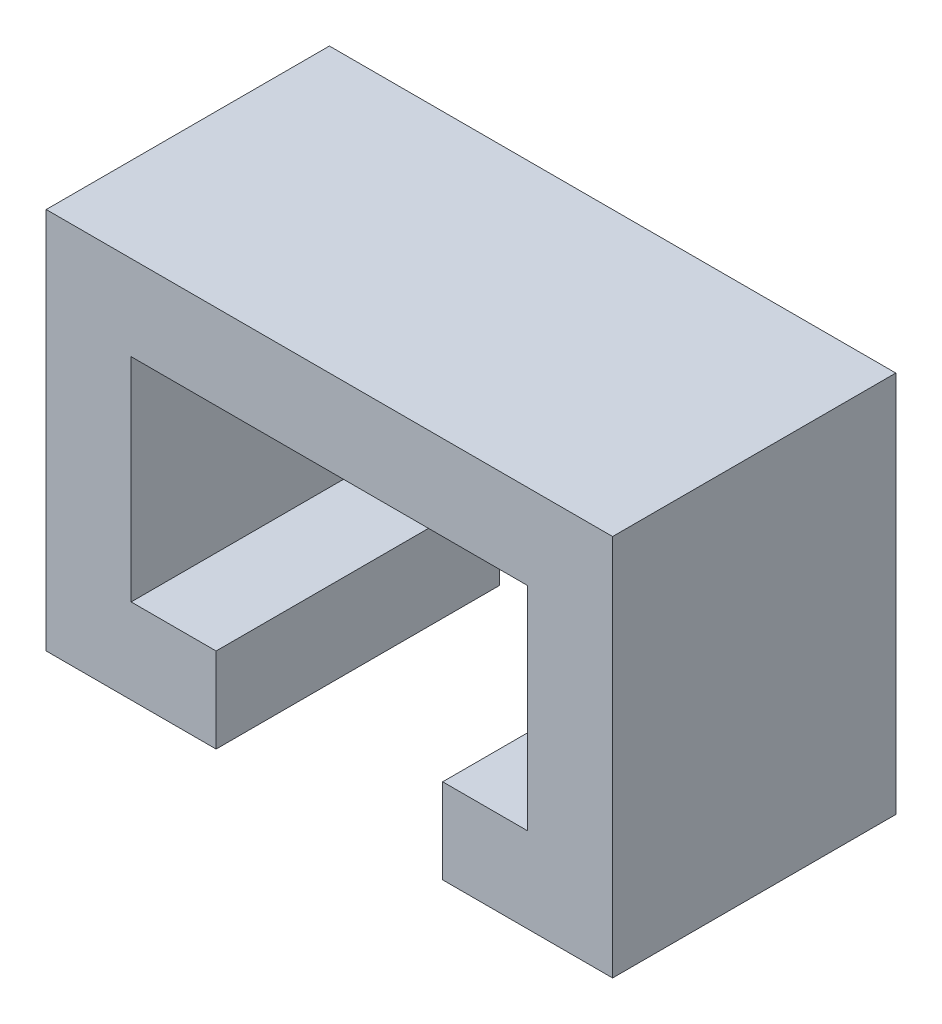
ISO-10303-21;
HEADER;
FILE_DESCRIPTION(('STEP AP214'),'2;1');
FILE_NAME('part.step','',(''),(''),'','','');
FILE_SCHEMA(('AUTOMOTIVE_DESIGN { 1 0 10303 214 1 1 1 1 }'));
ENDSEC;
DATA;
#1=APPLICATION_CONTEXT('core data for automotive mechanical design processes');
#2=APPLICATION_PROTOCOL_DEFINITION('international standard','automotive_design',2000,#1);
#3=PRODUCT_CONTEXT('',#1,'mechanical');
#4=PRODUCT('Part','Part','',(#3));
#5=PRODUCT_RELATED_PRODUCT_CATEGORY('part','',(#4));
#6=PRODUCT_DEFINITION_FORMATION('','',#4);
#7=PRODUCT_DEFINITION_CONTEXT('part definition',#1,'design');
#8=PRODUCT_DEFINITION('design','',#6,#7);
#9=PRODUCT_DEFINITION_SHAPE('','',#8);
#10=(LENGTH_UNIT() NAMED_UNIT(*) SI_UNIT(.MILLI.,.METRE.));
#11=(NAMED_UNIT(*) PLANE_ANGLE_UNIT() SI_UNIT($,.RADIAN.));
#12=(NAMED_UNIT(*) SI_UNIT($,.STERADIAN.) SOLID_ANGLE_UNIT());
#13=UNCERTAINTY_MEASURE_WITH_UNIT(LENGTH_MEASURE(1.E-05),#10,'distance_accuracy_value','');
#14=(GEOMETRIC_REPRESENTATION_CONTEXT(3) GLOBAL_UNCERTAINTY_ASSIGNED_CONTEXT((#13)) GLOBAL_UNIT_ASSIGNED_CONTEXT((#10,
#11,#12)) REPRESENTATION_CONTEXT('',''));
#15=CARTESIAN_POINT('',(0.,0.,0.));
#16=DIRECTION('',(0.,0.,1.));
#17=DIRECTION('',(1.,0.,0.));
#18=AXIS2_PLACEMENT_3D('',#15,#16,#17);
#19=CARTESIAN_POINT('',(-4.,0.,10.));
#20=DIRECTION('',(0.,-1.,0.));
#21=DIRECTION('',(1.,0.,0.));
#22=AXIS2_PLACEMENT_3D('',#19,#20,#21);
#23=PLANE('',#22);
#24=DIRECTION('',(-1.,0.,0.));
#25=VECTOR('',#24,1.);
#26=CARTESIAN_POINT('',(-4.,0.,0.));
#27=LINE('',#26,#25);
#28=CARTESIAN_POINT('',(-4.,0.,0.));
#29=VERTEX_POINT('',#28);
#30=CARTESIAN_POINT('',(-7.,0.,0.));
#31=VERTEX_POINT('',#30);
#32=EDGE_CURVE('E159',#29,#31,#27,.T.);
#33=ORIENTED_EDGE('',*,*,#32,.T.);
#34=DIRECTION('',(0.,0.,-1.));
#35=VECTOR('',#34,1.);
#36=CARTESIAN_POINT('',(-7.,0.,10.));
#37=LINE('',#36,#35);
#38=CARTESIAN_POINT('',(-7.,0.,10.));
#39=VERTEX_POINT('',#38);
#40=EDGE_CURVE('E11',#39,#31,#37,.T.);
#41=ORIENTED_EDGE('',*,*,#40,.F.);
#42=DIRECTION('',(-1.,0.,0.));
#43=VECTOR('',#42,1.);
#44=CARTESIAN_POINT('',(-4.,0.,10.));
#45=LINE('',#44,#43);
#46=CARTESIAN_POINT('',(-4.,0.,10.));
#47=VERTEX_POINT('',#46);
#48=EDGE_CURVE('E181',#47,#39,#45,.T.);
#49=ORIENTED_EDGE('',*,*,#48,.F.);
#50=DIRECTION('',(0.,0.,-1.));
#51=VECTOR('',#50,1.);
#52=CARTESIAN_POINT('',(-4.,0.,10.));
#53=LINE('',#52,#51);
#54=EDGE_CURVE('E155',#47,#29,#53,.T.);
#55=ORIENTED_EDGE('',*,*,#54,.T.);
#56=EDGE_LOOP('',(#33,#41,#49,#55));
#57=FACE_BOUND('',#56,.T.);
#58=ADVANCED_FACE('F39',(#57),#23,.F.);
#59=CARTESIAN_POINT('',(-7.,0.,10.));
#60=DIRECTION('',(-1.,0.,0.));
#61=DIRECTION('',(0.,-1.,0.));
#62=AXIS2_PLACEMENT_3D('',#59,#60,#61);
#63=PLANE('',#62);
#64=DIRECTION('',(0.,1.,0.));
#65=VECTOR('',#64,1.);
#66=CARTESIAN_POINT('',(-7.,0.,0.));
#67=LINE('',#66,#65);
#68=CARTESIAN_POINT('',(-7.,7.5,0.));
#69=VERTEX_POINT('',#68);
#70=EDGE_CURVE('E162',#31,#69,#67,.T.);
#71=ORIENTED_EDGE('',*,*,#70,.T.);
#72=DIRECTION('',(0.,0.,-1.));
#73=VECTOR('',#72,1.);
#74=CARTESIAN_POINT('',(-7.,7.5,10.));
#75=LINE('',#74,#73);
#76=CARTESIAN_POINT('',(-7.,7.5,10.));
#77=VERTEX_POINT('',#76);
#78=EDGE_CURVE('E47',#77,#69,#75,.T.);
#79=ORIENTED_EDGE('',*,*,#78,.F.);
#80=DIRECTION('',(0.,1.,0.));
#81=VECTOR('',#80,1.);
#82=CARTESIAN_POINT('',(-7.,0.,10.));
#83=LINE('',#82,#81);
#84=EDGE_CURVE('E110',#39,#77,#83,.T.);
#85=ORIENTED_EDGE('',*,*,#84,.F.);
#86=ORIENTED_EDGE('',*,*,#40,.T.);
#87=EDGE_LOOP('',(#71,#79,#85,#86));
#88=FACE_BOUND('',#87,.T.);
#89=ADVANCED_FACE('F259',(#88),#63,.F.);
#90=CARTESIAN_POINT('',(-7.,7.5,10.));
#91=DIRECTION('',(0.,1.,0.));
#92=DIRECTION('',(-1.,0.,0.));
#93=AXIS2_PLACEMENT_3D('',#90,#91,#92);
#94=PLANE('',#93);
#95=DIRECTION('',(1.,0.,0.));
#96=VECTOR('',#95,1.);
#97=CARTESIAN_POINT('',(-7.,7.5,0.));
#98=LINE('',#97,#96);
#99=CARTESIAN_POINT('',(7.,7.5,0.));
#100=VERTEX_POINT('',#99);
#101=EDGE_CURVE('E164',#69,#100,#98,.T.);
#102=ORIENTED_EDGE('',*,*,#101,.T.);
#103=DIRECTION('',(0.,0.,-1.));
#104=VECTOR('',#103,1.);
#105=CARTESIAN_POINT('',(7.,7.5,10.));
#106=LINE('',#105,#104);
#107=CARTESIAN_POINT('',(7.,7.5,10.));
#108=VERTEX_POINT('',#107);
#109=EDGE_CURVE('E200',#108,#100,#106,.T.);
#110=ORIENTED_EDGE('',*,*,#109,.F.);
#111=DIRECTION('',(1.,0.,0.));
#112=VECTOR('',#111,1.);
#113=CARTESIAN_POINT('',(-7.,7.5,10.));
#114=LINE('',#113,#112);
#115=EDGE_CURVE('E208',#77,#108,#114,.T.);
#116=ORIENTED_EDGE('',*,*,#115,.F.);
#117=ORIENTED_EDGE('',*,*,#78,.T.);
#118=EDGE_LOOP('',(#102,#110,#116,#117));
#119=FACE_BOUND('',#118,.T.);
#120=ADVANCED_FACE('F206',(#119),#94,.F.);
#121=CARTESIAN_POINT('',(7.,7.5,10.));
#122=DIRECTION('',(1.,0.,0.));
#123=DIRECTION('',(0.,1.,0.));
#124=AXIS2_PLACEMENT_3D('',#121,#122,#123);
#125=PLANE('',#124);
#126=DIRECTION('',(0.,-1.,0.));
#127=VECTOR('',#126,1.);
#128=CARTESIAN_POINT('',(7.,7.5,0.));
#129=LINE('',#128,#127);
#130=CARTESIAN_POINT('',(7.,0.,0.));
#131=VERTEX_POINT('',#130);
#132=EDGE_CURVE('E166',#100,#131,#129,.T.);
#133=ORIENTED_EDGE('',*,*,#132,.T.);
#134=DIRECTION('',(0.,0.,-1.));
#135=VECTOR('',#134,1.);
#136=CARTESIAN_POINT('',(7.,0.,10.));
#137=LINE('',#136,#135);
#138=CARTESIAN_POINT('',(7.,0.,10.));
#139=VERTEX_POINT('',#138);
#140=EDGE_CURVE('E197',#139,#131,#137,.T.);
#141=ORIENTED_EDGE('',*,*,#140,.F.);
#142=DIRECTION('',(0.,-1.,0.));
#143=VECTOR('',#142,1.);
#144=CARTESIAN_POINT('',(7.,7.5,10.));
#145=LINE('',#144,#143);
#146=EDGE_CURVE('E226',#108,#139,#145,.T.);
#147=ORIENTED_EDGE('',*,*,#146,.F.);
#148=ORIENTED_EDGE('',*,*,#109,.T.);
#149=EDGE_LOOP('',(#133,#141,#147,#148));
#150=FACE_BOUND('',#149,.T.);
#151=ADVANCED_FACE('F217',(#150),#125,.F.);
#152=CARTESIAN_POINT('',(7.,0.,10.));
#153=DIRECTION('',(0.,-1.,0.));
#154=DIRECTION('',(1.,0.,0.));
#155=AXIS2_PLACEMENT_3D('',#152,#153,#154);
#156=PLANE('',#155);
#157=DIRECTION('',(-1.,0.,0.));
#158=VECTOR('',#157,1.);
#159=CARTESIAN_POINT('',(7.,0.,0.));
#160=LINE('',#159,#158);
#161=CARTESIAN_POINT('',(4.,0.,0.));
#162=VERTEX_POINT('',#161);
#163=EDGE_CURVE('E168',#131,#162,#160,.T.);
#164=ORIENTED_EDGE('',*,*,#163,.T.);
#165=DIRECTION('',(0.,0.,-1.));
#166=VECTOR('',#165,1.);
#167=CARTESIAN_POINT('',(4.,0.,10.));
#168=LINE('',#167,#166);
#169=CARTESIAN_POINT('',(4.,0.,10.));
#170=VERTEX_POINT('',#169);
#171=EDGE_CURVE('E194',#170,#162,#168,.T.);
#172=ORIENTED_EDGE('',*,*,#171,.F.);
#173=DIRECTION('',(-1.,0.,0.));
#174=VECTOR('',#173,1.);
#175=CARTESIAN_POINT('',(7.,0.,10.));
#176=LINE('',#175,#174);
#177=EDGE_CURVE('E223',#139,#170,#176,.T.);
#178=ORIENTED_EDGE('',*,*,#177,.F.);
#179=ORIENTED_EDGE('',*,*,#140,.T.);
#180=EDGE_LOOP('',(#164,#172,#178,#179));
#181=FACE_BOUND('',#180,.T.);
#182=ADVANCED_FACE('F221',(#181),#156,.F.);
#183=CARTESIAN_POINT('',(4.,0.,10.));
#184=DIRECTION('',(1.,0.,0.));
#185=DIRECTION('',(0.,0.,-1.));
#186=AXIS2_PLACEMENT_3D('',#183,#184,#185);
#187=PLANE('',#186);
#188=DIRECTION('',(0.,-1.,0.));
#189=VECTOR('',#188,1.);
#190=CARTESIAN_POINT('',(4.,0.,0.));
#191=LINE('',#190,#189);
#192=CARTESIAN_POINT('',(4.,-3.,0.));
#193=VERTEX_POINT('',#192);
#194=EDGE_CURVE('E170',#162,#193,#191,.T.);
#195=ORIENTED_EDGE('',*,*,#194,.T.);
#196=DIRECTION('',(0.,0.,-1.));
#197=VECTOR('',#196,1.);
#198=CARTESIAN_POINT('',(4.,-3.,10.));
#199=LINE('',#198,#197);
#200=CARTESIAN_POINT('',(4.,-3.,10.));
#201=VERTEX_POINT('',#200);
#202=EDGE_CURVE('E191',#201,#193,#199,.T.);
#203=ORIENTED_EDGE('',*,*,#202,.F.);
#204=DIRECTION('',(0.,-1.,0.));
#205=VECTOR('',#204,1.);
#206=CARTESIAN_POINT('',(4.,0.,10.));
#207=LINE('',#206,#205);
#208=EDGE_CURVE('E225',#170,#201,#207,.T.);
#209=ORIENTED_EDGE('',*,*,#208,.F.);
#210=ORIENTED_EDGE('',*,*,#171,.T.);
#211=EDGE_LOOP('',(#195,#203,#209,#210));
#212=FACE_BOUND('',#211,.T.);
#213=ADVANCED_FACE('F272',(#212),#187,.F.);
#214=CARTESIAN_POINT('',(4.,-3.,10.));
#215=DIRECTION('',(0.,1.,0.));
#216=DIRECTION('',(-1.,0.,0.));
#217=AXIS2_PLACEMENT_3D('',#214,#215,#216);
#218=PLANE('',#217);
#219=DIRECTION('',(1.,0.,0.));
#220=VECTOR('',#219,1.);
#221=CARTESIAN_POINT('',(4.,-3.,0.));
#222=LINE('',#221,#220);
#223=CARTESIAN_POINT('',(9.99999999999999,-3.,0.));
#224=VERTEX_POINT('',#223);
#225=EDGE_CURVE('E172',#193,#224,#222,.T.);
#226=ORIENTED_EDGE('',*,*,#225,.T.);
#227=DIRECTION('',(0.,0.,-1.));
#228=VECTOR('',#227,1.);
#229=CARTESIAN_POINT('',(9.99999999999999,-3.,10.));
#230=LINE('',#229,#228);
#231=CARTESIAN_POINT('',(9.99999999999999,-3.,10.));
#232=VERTEX_POINT('',#231);
#233=EDGE_CURVE('E188',#232,#224,#230,.T.);
#234=ORIENTED_EDGE('',*,*,#233,.F.);
#235=DIRECTION('',(1.,0.,0.));
#236=VECTOR('',#235,1.);
#237=CARTESIAN_POINT('',(4.,-3.,10.));
#238=LINE('',#237,#236);
#239=EDGE_CURVE('E228',#201,#232,#238,.T.);
#240=ORIENTED_EDGE('',*,*,#239,.F.);
#241=ORIENTED_EDGE('',*,*,#202,.T.);
#242=EDGE_LOOP('',(#226,#234,#240,#241));
#243=FACE_BOUND('',#242,.T.);
#244=ADVANCED_FACE('F275',(#243),#218,.F.);
#245=CARTESIAN_POINT('',(9.99999999999999,-3.,10.));
#246=DIRECTION('',(-1.,0.,0.));
#247=DIRECTION('',(0.,-1.,0.));
#248=AXIS2_PLACEMENT_3D('',#245,#246,#247);
#249=PLANE('',#248);
#250=DIRECTION('',(0.,1.,0.));
#251=VECTOR('',#250,1.);
#252=CARTESIAN_POINT('',(9.99999999999999,-3.,0.));
#253=LINE('',#252,#251);
#254=CARTESIAN_POINT('',(10.,10.5,0.));
#255=VERTEX_POINT('',#254);
#256=EDGE_CURVE('E174',#224,#255,#253,.T.);
#257=ORIENTED_EDGE('',*,*,#256,.T.);
#258=DIRECTION('',(0.,0.,-1.));
#259=VECTOR('',#258,1.);
#260=CARTESIAN_POINT('',(10.,10.5,10.));
#261=LINE('',#260,#259);
#262=CARTESIAN_POINT('',(10.,10.5,10.));
#263=VERTEX_POINT('',#262);
#264=EDGE_CURVE('E185',#263,#255,#261,.T.);
#265=ORIENTED_EDGE('',*,*,#264,.F.);
#266=DIRECTION('',(0.,1.,0.));
#267=VECTOR('',#266,1.);
#268=CARTESIAN_POINT('',(9.99999999999999,-3.,10.));
#269=LINE('',#268,#267);
#270=EDGE_CURVE('E234',#232,#263,#269,.T.);
#271=ORIENTED_EDGE('',*,*,#270,.F.);
#272=ORIENTED_EDGE('',*,*,#233,.T.);
#273=EDGE_LOOP('',(#257,#265,#271,#272));
#274=FACE_BOUND('',#273,.T.);
#275=ADVANCED_FACE('F240',(#274),#249,.F.);
#276=CARTESIAN_POINT('',(10.,10.5,10.));
#277=DIRECTION('',(0.,-1.,0.));
#278=DIRECTION('',(0.,0.,-1.));
#279=AXIS2_PLACEMENT_3D('',#276,#277,#278);
#280=PLANE('',#279);
#281=DIRECTION('',(-1.,0.,0.));
#282=VECTOR('',#281,1.);
#283=CARTESIAN_POINT('',(10.,10.5,0.));
#284=LINE('',#283,#282);
#285=CARTESIAN_POINT('',(-10.,10.5,0.));
#286=VERTEX_POINT('',#285);
#287=EDGE_CURVE('E176',#255,#286,#284,.T.);
#288=ORIENTED_EDGE('',*,*,#287,.T.);
#289=DIRECTION('',(0.,0.,-1.));
#290=VECTOR('',#289,1.);
#291=CARTESIAN_POINT('',(-10.,10.5,10.));
#292=LINE('',#291,#290);
#293=CARTESIAN_POINT('',(-10.,10.5,10.));
#294=VERTEX_POINT('',#293);
#295=EDGE_CURVE('E150',#294,#286,#292,.T.);
#296=ORIENTED_EDGE('',*,*,#295,.F.);
#297=DIRECTION('',(-1.,0.,0.));
#298=VECTOR('',#297,1.);
#299=CARTESIAN_POINT('',(10.,10.5,10.));
#300=LINE('',#299,#298);
#301=EDGE_CURVE('E141',#263,#294,#300,.T.);
#302=ORIENTED_EDGE('',*,*,#301,.F.);
#303=ORIENTED_EDGE('',*,*,#264,.T.);
#304=EDGE_LOOP('',(#288,#296,#302,#303));
#305=FACE_BOUND('',#304,.T.);
#306=ADVANCED_FACE('F244',(#305),#280,.F.);
#307=CARTESIAN_POINT('',(-10.,10.5,10.));
#308=DIRECTION('',(1.,0.,0.));
#309=DIRECTION('',(0.,1.,0.));
#310=AXIS2_PLACEMENT_3D('',#307,#308,#309);
#311=PLANE('',#310);
#312=DIRECTION('',(0.,-1.,0.));
#313=VECTOR('',#312,1.);
#314=CARTESIAN_POINT('',(-10.,10.5,0.));
#315=LINE('',#314,#313);
#316=CARTESIAN_POINT('',(-9.99999999999999,-3.,0.));
#317=VERTEX_POINT('',#316);
#318=EDGE_CURVE('E149',#286,#317,#315,.T.);
#319=ORIENTED_EDGE('',*,*,#318,.T.);
#320=DIRECTION('',(0.,0.,-1.));
#321=VECTOR('',#320,1.);
#322=CARTESIAN_POINT('',(-9.99999999999999,-3.,10.));
#323=LINE('',#322,#321);
#324=CARTESIAN_POINT('',(-9.99999999999999,-3.,10.));
#325=VERTEX_POINT('',#324);
#326=EDGE_CURVE('E146',#325,#317,#323,.T.);
#327=ORIENTED_EDGE('',*,*,#326,.F.);
#328=DIRECTION('',(0.,-1.,0.));
#329=VECTOR('',#328,1.);
#330=CARTESIAN_POINT('',(-10.,10.5,10.));
#331=LINE('',#330,#329);
#332=EDGE_CURVE('E135',#294,#325,#331,.T.);
#333=ORIENTED_EDGE('',*,*,#332,.F.);
#334=ORIENTED_EDGE('',*,*,#295,.T.);
#335=EDGE_LOOP('',(#319,#327,#333,#334));
#336=FACE_BOUND('',#335,.T.);
#337=ADVANCED_FACE('F147',(#336),#311,.F.);
#338=CARTESIAN_POINT('',(-9.99999999999999,-3.,10.));
#339=DIRECTION('',(0.,1.,0.));
#340=DIRECTION('',(-1.,0.,0.));
#341=AXIS2_PLACEMENT_3D('',#338,#339,#340);
#342=PLANE('',#341);
#343=DIRECTION('',(1.,0.,0.));
#344=VECTOR('',#343,1.);
#345=CARTESIAN_POINT('',(-9.99999999999999,-3.,0.));
#346=LINE('',#345,#344);
#347=CARTESIAN_POINT('',(-4.,-3.,0.));
#348=VERTEX_POINT('',#347);
#349=EDGE_CURVE('E96',#317,#348,#346,.T.);
#350=ORIENTED_EDGE('',*,*,#349,.T.);
#351=DIRECTION('',(0.,0.,-1.));
#352=VECTOR('',#351,1.);
#353=CARTESIAN_POINT('',(-4.,-3.,10.));
#354=LINE('',#353,#352);
#355=CARTESIAN_POINT('',(-4.,-3.,10.));
#356=VERTEX_POINT('',#355);
#357=EDGE_CURVE('E151',#356,#348,#354,.T.);
#358=ORIENTED_EDGE('',*,*,#357,.F.);
#359=DIRECTION('',(1.,0.,0.));
#360=VECTOR('',#359,1.);
#361=CARTESIAN_POINT('',(-9.99999999999999,-3.,10.));
#362=LINE('',#361,#360);
#363=EDGE_CURVE('E139',#325,#356,#362,.T.);
#364=ORIENTED_EDGE('',*,*,#363,.F.);
#365=ORIENTED_EDGE('',*,*,#326,.T.);
#366=EDGE_LOOP('',(#350,#358,#364,#365));
#367=FACE_BOUND('',#366,.T.);
#368=ADVANCED_FACE('F153',(#367),#342,.F.);
#369=CARTESIAN_POINT('',(-4.,-3.,10.));
#370=DIRECTION('',(-1.,0.,0.));
#371=DIRECTION('',(0.,0.,1.));
#372=AXIS2_PLACEMENT_3D('',#369,#370,#371);
#373=PLANE('',#372);
#374=DIRECTION('',(0.,1.,0.));
#375=VECTOR('',#374,1.);
#376=CARTESIAN_POINT('',(-4.,-3.,0.));
#377=LINE('',#376,#375);
#378=EDGE_CURVE('E102',#348,#29,#377,.T.);
#379=ORIENTED_EDGE('',*,*,#378,.T.);
#380=ORIENTED_EDGE('',*,*,#54,.F.);
#381=DIRECTION('',(0.,1.,0.));
#382=VECTOR('',#381,1.);
#383=CARTESIAN_POINT('',(-4.,-3.,10.));
#384=LINE('',#383,#382);
#385=EDGE_CURVE('E55',#356,#47,#384,.T.);
#386=ORIENTED_EDGE('',*,*,#385,.F.);
#387=ORIENTED_EDGE('',*,*,#357,.T.);
#388=EDGE_LOOP('',(#379,#380,#386,#387));
#389=FACE_BOUND('',#388,.T.);
#390=ADVANCED_FACE('F248',(#389),#373,.F.);
#391=CARTESIAN_POINT('',(0.,0.,10.));
#392=DIRECTION('',(0.,0.,-1.));
#393=DIRECTION('',(-1.,0.,0.));
#394=AXIS2_PLACEMENT_3D('',#391,#392,#393);
#395=PLANE('',#394);
#396=ORIENTED_EDGE('',*,*,#48,.T.);
#397=ORIENTED_EDGE('',*,*,#84,.T.);
#398=ORIENTED_EDGE('',*,*,#115,.T.);
#399=ORIENTED_EDGE('',*,*,#146,.T.);
#400=ORIENTED_EDGE('',*,*,#177,.T.);
#401=ORIENTED_EDGE('',*,*,#208,.T.);
#402=ORIENTED_EDGE('',*,*,#239,.T.);
#403=ORIENTED_EDGE('',*,*,#270,.T.);
#404=ORIENTED_EDGE('',*,*,#301,.T.);
#405=ORIENTED_EDGE('',*,*,#332,.T.);
#406=ORIENTED_EDGE('',*,*,#363,.T.);
#407=ORIENTED_EDGE('',*,*,#385,.T.);
#408=EDGE_LOOP('',(#396,#397,#398,#399,#400,#401,#402,#403,#404,#405,#406,#407));
#409=FACE_BOUND('',#408,.T.);
#410=ADVANCED_FACE('F137',(#409),#395,.F.);
#411=CARTESIAN_POINT('',(0.,0.,0.));
#412=DIRECTION('',(0.,0.,-1.));
#413=DIRECTION('',(-1.,0.,0.));
#414=AXIS2_PLACEMENT_3D('',#411,#412,#413);
#415=PLANE('',#414);
#416=ORIENTED_EDGE('',*,*,#32,.F.);
#417=ORIENTED_EDGE('',*,*,#378,.F.);
#418=ORIENTED_EDGE('',*,*,#349,.F.);
#419=ORIENTED_EDGE('',*,*,#318,.F.);
#420=ORIENTED_EDGE('',*,*,#287,.F.);
#421=ORIENTED_EDGE('',*,*,#256,.F.);
#422=ORIENTED_EDGE('',*,*,#225,.F.);
#423=ORIENTED_EDGE('',*,*,#194,.F.);
#424=ORIENTED_EDGE('',*,*,#163,.F.);
#425=ORIENTED_EDGE('',*,*,#132,.F.);
#426=ORIENTED_EDGE('',*,*,#101,.F.);
#427=ORIENTED_EDGE('',*,*,#70,.F.);
#428=EDGE_LOOP('',(#416,#417,#418,#419,#420,#421,#422,#423,#424,#425,#426,#427));
#429=FACE_BOUND('',#428,.T.);
#430=ADVANCED_FACE('F212',(#429),#415,.T.);
#431=CLOSED_SHELL('',(#58,#89,#120,#151,#182,#213,#244,#275,#306,#337,#368,#390,#410,#430));
#432=MANIFOLD_SOLID_BREP('B2',#431);
#433=ADVANCED_BREP_SHAPE_REPRESENTATION('',(#18,#432),#14);
#434=SHAPE_DEFINITION_REPRESENTATION(#9,#433);
ENDSEC;
END-ISO-10303-21;
